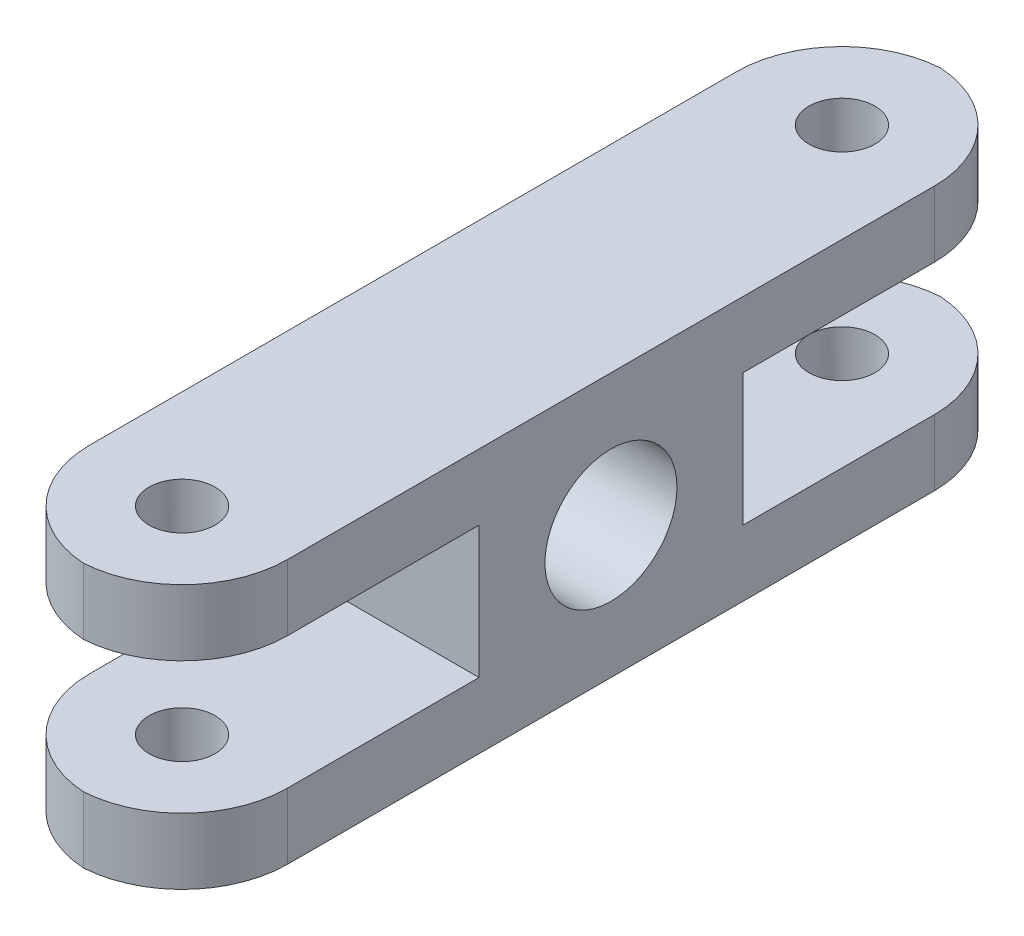
ISO-10303-21;
HEADER;
FILE_DESCRIPTION(('STEP AP214'),'2;1');
FILE_NAME('part.step','',(''),(''),'','','');
FILE_SCHEMA(('AUTOMOTIVE_DESIGN { 1 0 10303 214 1 1 1 1 }'));
ENDSEC;
DATA;
#1=APPLICATION_CONTEXT('core data for automotive mechanical design processes');
#2=APPLICATION_PROTOCOL_DEFINITION('international standard','automotive_design',2000,#1);
#3=PRODUCT_CONTEXT('',#1,'mechanical');
#4=PRODUCT('Part','Part','',(#3));
#5=PRODUCT_RELATED_PRODUCT_CATEGORY('part','',(#4));
#6=PRODUCT_DEFINITION_FORMATION('','',#4);
#7=PRODUCT_DEFINITION_CONTEXT('part definition',#1,'design');
#8=PRODUCT_DEFINITION('design','',#6,#7);
#9=PRODUCT_DEFINITION_SHAPE('','',#8);
#10=(LENGTH_UNIT() NAMED_UNIT(*) SI_UNIT(.MILLI.,.METRE.));
#11=(NAMED_UNIT(*) PLANE_ANGLE_UNIT() SI_UNIT($,.RADIAN.));
#12=(NAMED_UNIT(*) SI_UNIT($,.STERADIAN.) SOLID_ANGLE_UNIT());
#13=UNCERTAINTY_MEASURE_WITH_UNIT(LENGTH_MEASURE(1.E-05),#10,'distance_accuracy_value','');
#14=(GEOMETRIC_REPRESENTATION_CONTEXT(3) GLOBAL_UNCERTAINTY_ASSIGNED_CONTEXT((#13)) GLOBAL_UNIT_ASSIGNED_CONTEXT((#10,
#11,#12)) REPRESENTATION_CONTEXT('',''));
#15=CARTESIAN_POINT('',(0.,0.,0.));
#16=DIRECTION('',(0.,0.,1.));
#17=DIRECTION('',(1.,0.,0.));
#18=AXIS2_PLACEMENT_3D('',#15,#16,#17);
#19=CARTESIAN_POINT('',(7.5,20.,32.5));
#20=DIRECTION('',(-1.,0.,0.));
#21=DIRECTION('',(0.,0.,1.));
#22=AXIS2_PLACEMENT_3D('',#19,#20,#21);
#23=PLANE('',#22);
#24=CARTESIAN_POINT('',(7.5,10.,0.));
#25=DIRECTION('',(1.,0.,0.));
#26=DIRECTION('',(0.,0.,-1.));
#27=AXIS2_PLACEMENT_3D('',#24,#25,#26);
#28=CIRCLE('',#27,5.);
#29=CARTESIAN_POINT('',(7.5,10.,-5.));
#30=VERTEX_POINT('',#29);
#31=EDGE_CURVE('E212',#30,#30,#28,.T.);
#32=ORIENTED_EDGE('',*,*,#31,.F.);
#33=EDGE_LOOP('',(#32));
#34=FACE_BOUND('',#33,.T.);
#35=DIRECTION('',(0.,0.,1.));
#36=VECTOR('',#35,1.);
#37=CARTESIAN_POINT('',(7.5,5.,0.));
#38=LINE('',#37,#36);
#39=CARTESIAN_POINT('',(7.5,5.,9.99999999999999));
#40=VERTEX_POINT('',#39);
#41=CARTESIAN_POINT('',(7.5,5.,24.5));
#42=VERTEX_POINT('',#41);
#43=EDGE_CURVE('E167',#40,#42,#38,.T.);
#44=ORIENTED_EDGE('',*,*,#43,.T.);
#45=DIRECTION('',(0.,-1.,0.));
#46=VECTOR('',#45,1.);
#47=CARTESIAN_POINT('',(7.5,20.,24.5));
#48=LINE('',#47,#46);
#49=CARTESIAN_POINT('',(7.5,0.,24.5));
#50=VERTEX_POINT('',#49);
#51=EDGE_CURVE('E275',#42,#50,#48,.T.);
#52=ORIENTED_EDGE('',*,*,#51,.T.);
#53=DIRECTION('',(0.,0.,-1.));
#54=VECTOR('',#53,1.);
#55=CARTESIAN_POINT('',(7.5,0.,32.5));
#56=LINE('',#55,#54);
#57=CARTESIAN_POINT('',(7.5,0.,-24.5));
#58=VERTEX_POINT('',#57);
#59=EDGE_CURVE('E219',#50,#58,#56,.T.);
#60=ORIENTED_EDGE('',*,*,#59,.T.);
#61=DIRECTION('',(0.,-1.,0.));
#62=VECTOR('',#61,1.);
#63=CARTESIAN_POINT('',(7.5,20.,-24.5));
#64=LINE('',#63,#62);
#65=CARTESIAN_POINT('',(7.5,5.,-24.5));
#66=VERTEX_POINT('',#65);
#67=EDGE_CURVE('E272',#58,#66,#64,.F.);
#68=ORIENTED_EDGE('',*,*,#67,.T.);
#69=DIRECTION('',(0.,0.,-1.));
#70=VECTOR('',#69,1.);
#71=CARTESIAN_POINT('',(7.5,5.,0.));
#72=LINE('',#71,#70);
#73=CARTESIAN_POINT('',(7.5,5.,-10.));
#74=VERTEX_POINT('',#73);
#75=EDGE_CURVE('E190',#74,#66,#72,.T.);
#76=ORIENTED_EDGE('',*,*,#75,.F.);
#77=DIRECTION('',(0.,-1.,0.));
#78=VECTOR('',#77,1.);
#79=CARTESIAN_POINT('',(7.5,0.,-10.));
#80=LINE('',#79,#78);
#81=CARTESIAN_POINT('',(7.5,15.,-10.));
#82=VERTEX_POINT('',#81);
#83=EDGE_CURVE('E200',#82,#74,#80,.T.);
#84=ORIENTED_EDGE('',*,*,#83,.F.);
#85=DIRECTION('',(0.,0.,-1.));
#86=VECTOR('',#85,1.);
#87=CARTESIAN_POINT('',(7.5,15.,0.));
#88=LINE('',#87,#86);
#89=CARTESIAN_POINT('',(7.5,15.,-24.5));
#90=VERTEX_POINT('',#89);
#91=EDGE_CURVE('E197',#82,#90,#88,.T.);
#92=ORIENTED_EDGE('',*,*,#91,.T.);
#93=DIRECTION('',(0.,-1.,0.));
#94=VECTOR('',#93,1.);
#95=CARTESIAN_POINT('',(7.5,20.,-24.5));
#96=LINE('',#95,#94);
#97=CARTESIAN_POINT('',(7.5,20.,-24.5));
#98=VERTEX_POINT('',#97);
#99=EDGE_CURVE('E269',#90,#98,#96,.F.);
#100=ORIENTED_EDGE('',*,*,#99,.T.);
#101=DIRECTION('',(0.,0.,-1.));
#102=VECTOR('',#101,1.);
#103=CARTESIAN_POINT('',(7.5,20.,32.5));
#104=LINE('',#103,#102);
#105=CARTESIAN_POINT('',(7.5,20.,24.5));
#106=VERTEX_POINT('',#105);
#107=EDGE_CURVE('E228',#106,#98,#104,.T.);
#108=ORIENTED_EDGE('',*,*,#107,.F.);
#109=DIRECTION('',(0.,-1.,0.));
#110=VECTOR('',#109,1.);
#111=CARTESIAN_POINT('',(7.5,20.,24.5));
#112=LINE('',#111,#110);
#113=CARTESIAN_POINT('',(7.5,15.,24.5));
#114=VERTEX_POINT('',#113);
#115=EDGE_CURVE('E267',#106,#114,#112,.T.);
#116=ORIENTED_EDGE('',*,*,#115,.T.);
#117=DIRECTION('',(0.,0.,1.));
#118=VECTOR('',#117,1.);
#119=CARTESIAN_POINT('',(7.5,15.,0.));
#120=LINE('',#119,#118);
#121=CARTESIAN_POINT('',(7.5,15.,9.99999999999999));
#122=VERTEX_POINT('',#121);
#123=EDGE_CURVE('E175',#122,#114,#120,.T.);
#124=ORIENTED_EDGE('',*,*,#123,.F.);
#125=DIRECTION('',(0.,-1.,0.));
#126=VECTOR('',#125,1.);
#127=CARTESIAN_POINT('',(7.5,0.,9.99999999999999));
#128=LINE('',#127,#126);
#129=EDGE_CURVE('E177',#122,#40,#128,.T.);
#130=ORIENTED_EDGE('',*,*,#129,.T.);
#131=EDGE_LOOP('',(#44,#52,#60,#68,#76,#84,#92,#100,#108,#116,#124,#130));
#132=FACE_BOUND('',#131,.T.);
#133=ADVANCED_FACE('F36',(#34,#132),#23,.F.);
#134=CARTESIAN_POINT('',(-7.5,20.,32.5));
#135=DIRECTION('',(1.,0.,0.));
#136=DIRECTION('',(0.,0.,-1.));
#137=AXIS2_PLACEMENT_3D('',#134,#135,#136);
#138=PLANE('',#137);
#139=CARTESIAN_POINT('',(-7.5,10.,0.));
#140=DIRECTION('',(1.,0.,0.));
#141=DIRECTION('',(0.,0.,-1.));
#142=AXIS2_PLACEMENT_3D('',#139,#140,#141);
#143=CIRCLE('',#142,5.);
#144=CARTESIAN_POINT('',(-7.5,10.,-5.));
#145=VERTEX_POINT('',#144);
#146=EDGE_CURVE('E208',#145,#145,#143,.T.);
#147=ORIENTED_EDGE('',*,*,#146,.T.);
#148=EDGE_LOOP('',(#147));
#149=FACE_BOUND('',#148,.T.);
#150=DIRECTION('',(0.,0.,1.));
#151=VECTOR('',#150,1.);
#152=CARTESIAN_POINT('',(-7.5,0.,32.5));
#153=LINE('',#152,#151);
#154=CARTESIAN_POINT('',(-7.5,0.,-24.5));
#155=VERTEX_POINT('',#154);
#156=CARTESIAN_POINT('',(-7.5,0.,24.5));
#157=VERTEX_POINT('',#156);
#158=EDGE_CURVE('E231',#155,#157,#153,.T.);
#159=ORIENTED_EDGE('',*,*,#158,.T.);
#160=DIRECTION('',(0.,-1.,0.));
#161=VECTOR('',#160,1.);
#162=CARTESIAN_POINT('',(-7.5,20.,24.5));
#163=LINE('',#162,#161);
#164=CARTESIAN_POINT('',(-7.5,5.,24.5));
#165=VERTEX_POINT('',#164);
#166=EDGE_CURVE('E174',#157,#165,#163,.F.);
#167=ORIENTED_EDGE('',*,*,#166,.T.);
#168=DIRECTION('',(0.,0.,1.));
#169=VECTOR('',#168,1.);
#170=CARTESIAN_POINT('',(-7.5,5.,0.));
#171=LINE('',#170,#169);
#172=CARTESIAN_POINT('',(-7.5,5.,9.99999999999999));
#173=VERTEX_POINT('',#172);
#174=EDGE_CURVE('E161',#173,#165,#171,.T.);
#175=ORIENTED_EDGE('',*,*,#174,.F.);
#176=DIRECTION('',(0.,-1.,0.));
#177=VECTOR('',#176,1.);
#178=CARTESIAN_POINT('',(-7.5,0.,9.99999999999999));
#179=LINE('',#178,#177);
#180=CARTESIAN_POINT('',(-7.5,15.,9.99999999999999));
#181=VERTEX_POINT('',#180);
#182=EDGE_CURVE('E149',#181,#173,#179,.T.);
#183=ORIENTED_EDGE('',*,*,#182,.F.);
#184=DIRECTION('',(0.,0.,1.));
#185=VECTOR('',#184,1.);
#186=CARTESIAN_POINT('',(-7.5,15.,0.));
#187=LINE('',#186,#185);
#188=CARTESIAN_POINT('',(-7.5,15.,24.5));
#189=VERTEX_POINT('',#188);
#190=EDGE_CURVE('E160',#181,#189,#187,.T.);
#191=ORIENTED_EDGE('',*,*,#190,.T.);
#192=DIRECTION('',(0.,-1.,0.));
#193=VECTOR('',#192,1.);
#194=CARTESIAN_POINT('',(-7.5,20.,24.5));
#195=LINE('',#194,#193);
#196=CARTESIAN_POINT('',(-7.5,20.,24.5));
#197=VERTEX_POINT('',#196);
#198=EDGE_CURVE('E255',#189,#197,#195,.F.);
#199=ORIENTED_EDGE('',*,*,#198,.T.);
#200=DIRECTION('',(0.,0.,1.));
#201=VECTOR('',#200,1.);
#202=CARTESIAN_POINT('',(-7.5,20.,32.5));
#203=LINE('',#202,#201);
#204=CARTESIAN_POINT('',(-7.5,20.,-24.5));
#205=VERTEX_POINT('',#204);
#206=EDGE_CURVE('E230',#205,#197,#203,.T.);
#207=ORIENTED_EDGE('',*,*,#206,.F.);
#208=DIRECTION('',(0.,-1.,0.));
#209=VECTOR('',#208,1.);
#210=CARTESIAN_POINT('',(-7.5,20.,-24.5));
#211=LINE('',#210,#209);
#212=CARTESIAN_POINT('',(-7.5,15.,-24.5));
#213=VERTEX_POINT('',#212);
#214=EDGE_CURVE('E258',#205,#213,#211,.T.);
#215=ORIENTED_EDGE('',*,*,#214,.T.);
#216=DIRECTION('',(0.,0.,-1.));
#217=VECTOR('',#216,1.);
#218=CARTESIAN_POINT('',(-7.5,15.,0.));
#219=LINE('',#218,#217);
#220=CARTESIAN_POINT('',(-7.5,15.,-10.));
#221=VERTEX_POINT('',#220);
#222=EDGE_CURVE('E186',#221,#213,#219,.T.);
#223=ORIENTED_EDGE('',*,*,#222,.F.);
#224=DIRECTION('',(0.,-1.,0.));
#225=VECTOR('',#224,1.);
#226=CARTESIAN_POINT('',(-7.5,0.,-10.));
#227=LINE('',#226,#225);
#228=CARTESIAN_POINT('',(-7.5,5.,-10.));
#229=VERTEX_POINT('',#228);
#230=EDGE_CURVE('E189',#221,#229,#227,.T.);
#231=ORIENTED_EDGE('',*,*,#230,.T.);
#232=DIRECTION('',(0.,0.,-1.));
#233=VECTOR('',#232,1.);
#234=CARTESIAN_POINT('',(-7.5,5.,0.));
#235=LINE('',#234,#233);
#236=CARTESIAN_POINT('',(-7.5,5.,-24.5));
#237=VERTEX_POINT('',#236);
#238=EDGE_CURVE('E193',#229,#237,#235,.T.);
#239=ORIENTED_EDGE('',*,*,#238,.T.);
#240=DIRECTION('',(0.,-1.,0.));
#241=VECTOR('',#240,1.);
#242=CARTESIAN_POINT('',(-7.5,20.,-24.5));
#243=LINE('',#242,#241);
#244=EDGE_CURVE('E260',#237,#155,#243,.T.);
#245=ORIENTED_EDGE('',*,*,#244,.T.);
#246=EDGE_LOOP('',(#159,#167,#175,#183,#191,#199,#207,#215,#223,#231,#239,#245));
#247=FACE_BOUND('',#246,.T.);
#248=ADVANCED_FACE('F172',(#149,#247),#138,.F.);
#249=CARTESIAN_POINT('',(0.,0.,25.));
#250=DIRECTION('',(0.,1.,0.));
#251=DIRECTION('',(0.,0.,1.));
#252=AXIS2_PLACEMENT_3D('',#249,#250,#251);
#253=CYLINDRICAL_SURFACE('',#252,2.5);
#254=CARTESIAN_POINT('',(0.,0.,25.));
#255=DIRECTION('',(0.,-1.,0.));
#256=DIRECTION('',(0.,0.,-1.));
#257=AXIS2_PLACEMENT_3D('',#254,#255,#256);
#258=CIRCLE('',#257,2.5);
#259=CARTESIAN_POINT('',(0.,0.,22.5));
#260=VERTEX_POINT('',#259);
#261=EDGE_CURVE('E211',#260,#260,#258,.T.);
#262=ORIENTED_EDGE('',*,*,#261,.T.);
#263=EDGE_LOOP('',(#262));
#264=FACE_BOUND('',#263,.T.);
#265=CARTESIAN_POINT('',(0.,5.,25.));
#266=DIRECTION('',(0.,1.,0.));
#267=DIRECTION('',(0.,0.,1.));
#268=AXIS2_PLACEMENT_3D('',#265,#266,#267);
#269=CIRCLE('',#268,2.5);
#270=CARTESIAN_POINT('',(0.,5.,27.5));
#271=VERTEX_POINT('',#270);
#272=EDGE_CURVE('E243',#271,#271,#269,.T.);
#273=ORIENTED_EDGE('',*,*,#272,.T.);
#274=EDGE_LOOP('',(#273));
#275=FACE_BOUND('',#274,.T.);
#276=ADVANCED_FACE('F375',(#264,#275),#253,.F.);
#277=CARTESIAN_POINT('',(0.,0.,-25.));
#278=DIRECTION('',(0.,1.,0.));
#279=DIRECTION('',(0.,0.,1.));
#280=AXIS2_PLACEMENT_3D('',#277,#278,#279);
#281=CYLINDRICAL_SURFACE('',#280,2.5);
#282=CARTESIAN_POINT('',(0.,20.,-25.));
#283=DIRECTION('',(0.,1.,0.));
#284=DIRECTION('',(0.,0.,1.));
#285=AXIS2_PLACEMENT_3D('',#282,#283,#284);
#286=CIRCLE('',#285,2.5);
#287=CARTESIAN_POINT('',(0.,20.,-22.5));
#288=VERTEX_POINT('',#287);
#289=EDGE_CURVE('E220',#288,#288,#286,.T.);
#290=ORIENTED_EDGE('',*,*,#289,.T.);
#291=EDGE_LOOP('',(#290));
#292=FACE_BOUND('',#291,.T.);
#293=CARTESIAN_POINT('',(0.,15.,-25.));
#294=DIRECTION('',(0.,-1.,0.));
#295=DIRECTION('',(0.,0.,-1.));
#296=AXIS2_PLACEMENT_3D('',#293,#294,#295);
#297=CIRCLE('',#296,2.5);
#298=CARTESIAN_POINT('',(0.,15.,-27.5));
#299=VERTEX_POINT('',#298);
#300=EDGE_CURVE('E240',#299,#299,#297,.F.);
#301=ORIENTED_EDGE('',*,*,#300,.F.);
#302=EDGE_LOOP('',(#301));
#303=FACE_BOUND('',#302,.T.);
#304=ADVANCED_FACE('F478',(#292,#303),#281,.F.);
#305=CARTESIAN_POINT('',(0.,20.,0.));
#306=DIRECTION('',(0.,-1.,0.));
#307=DIRECTION('',(0.,0.,-1.));
#308=AXIS2_PLACEMENT_3D('',#305,#306,#307);
#309=PLANE('',#308);
#310=ORIENTED_EDGE('',*,*,#107,.T.);
#311=CARTESIAN_POINT('',(-0.499999999999998,20.,-24.5));
#312=DIRECTION('',(0.,-1.,0.));
#313=DIRECTION('',(0.,0.,-1.));
#314=AXIS2_PLACEMENT_3D('',#311,#312,#313);
#315=CIRCLE('',#314,8.);
#316=CARTESIAN_POINT('',(0.,20.,-32.4843597113357));
#317=VERTEX_POINT('',#316);
#318=EDGE_CURVE('E59',#98,#317,#315,.F.);
#319=ORIENTED_EDGE('',*,*,#318,.T.);
#320=CARTESIAN_POINT('',(0.500000000000003,20.,-24.5));
#321=DIRECTION('',(0.,-1.,0.));
#322=DIRECTION('',(0.,0.,-1.));
#323=AXIS2_PLACEMENT_3D('',#320,#321,#322);
#324=CIRCLE('',#323,8.);
#325=EDGE_CURVE('E289',#317,#205,#324,.F.);
#326=ORIENTED_EDGE('',*,*,#325,.T.);
#327=ORIENTED_EDGE('',*,*,#206,.T.);
#328=CARTESIAN_POINT('',(0.500000000000003,20.,24.5));
#329=DIRECTION('',(0.,-1.,0.));
#330=DIRECTION('',(0.,0.,-1.));
#331=AXIS2_PLACEMENT_3D('',#328,#329,#330);
#332=CIRCLE('',#331,8.);
#333=CARTESIAN_POINT('',(0.,20.,32.4843597113356));
#334=VERTEX_POINT('',#333);
#335=EDGE_CURVE('E287',#197,#334,#332,.F.);
#336=ORIENTED_EDGE('',*,*,#335,.T.);
#337=CARTESIAN_POINT('',(-0.499999999999998,20.,24.5));
#338=DIRECTION('',(0.,-1.,0.));
#339=DIRECTION('',(0.,0.,-1.));
#340=AXIS2_PLACEMENT_3D('',#337,#338,#339);
#341=CIRCLE('',#340,8.);
#342=EDGE_CURVE('E285',#334,#106,#341,.F.);
#343=ORIENTED_EDGE('',*,*,#342,.T.);
#344=EDGE_LOOP('',(#310,#319,#326,#327,#336,#343));
#345=FACE_BOUND('',#344,.T.);
#346=CARTESIAN_POINT('',(0.,20.,25.));
#347=DIRECTION('',(0.,-1.,0.));
#348=DIRECTION('',(0.,0.,-1.));
#349=AXIS2_PLACEMENT_3D('',#346,#347,#348);
#350=CIRCLE('',#349,2.5);
#351=CARTESIAN_POINT('',(0.,20.,22.5));
#352=VERTEX_POINT('',#351);
#353=EDGE_CURVE('E223',#352,#352,#350,.T.);
#354=ORIENTED_EDGE('',*,*,#353,.T.);
#355=EDGE_LOOP('',(#354));
#356=FACE_BOUND('',#355,.T.);
#357=ORIENTED_EDGE('',*,*,#289,.F.);
#358=EDGE_LOOP('',(#357));
#359=FACE_BOUND('',#358,.T.);
#360=ADVANCED_FACE('F311',(#345,#356,#359),#309,.F.);
#361=CARTESIAN_POINT('',(0.,0.,0.));
#362=DIRECTION('',(0.,-1.,0.));
#363=DIRECTION('',(0.,0.,-1.));
#364=AXIS2_PLACEMENT_3D('',#361,#362,#363);
#365=PLANE('',#364);
#366=ORIENTED_EDGE('',*,*,#261,.F.);
#367=EDGE_LOOP('',(#366));
#368=FACE_BOUND('',#367,.T.);
#369=CARTESIAN_POINT('',(-0.499999999999998,0.,24.5));
#370=DIRECTION('',(0.,-1.,0.));
#371=DIRECTION('',(0.,0.,-1.));
#372=AXIS2_PLACEMENT_3D('',#369,#370,#371);
#373=CIRCLE('',#372,8.);
#374=CARTESIAN_POINT('',(0.,0.,32.4843597113356));
#375=VERTEX_POINT('',#374);
#376=EDGE_CURVE('E251',#50,#375,#373,.T.);
#377=ORIENTED_EDGE('',*,*,#376,.T.);
#378=CARTESIAN_POINT('',(0.500000000000003,0.,24.5));
#379=DIRECTION('',(0.,-1.,0.));
#380=DIRECTION('',(0.,0.,-1.));
#381=AXIS2_PLACEMENT_3D('',#378,#379,#380);
#382=CIRCLE('',#381,8.);
#383=EDGE_CURVE('E253',#375,#157,#382,.T.);
#384=ORIENTED_EDGE('',*,*,#383,.T.);
#385=ORIENTED_EDGE('',*,*,#158,.F.);
#386=CARTESIAN_POINT('',(0.500000000000003,0.,-24.5));
#387=DIRECTION('',(0.,-1.,0.));
#388=DIRECTION('',(0.,0.,-1.));
#389=AXIS2_PLACEMENT_3D('',#386,#387,#388);
#390=CIRCLE('',#389,8.);
#391=CARTESIAN_POINT('',(0.,0.,-32.4843597113357));
#392=VERTEX_POINT('',#391);
#393=EDGE_CURVE('E234',#155,#392,#390,.T.);
#394=ORIENTED_EDGE('',*,*,#393,.T.);
#395=CARTESIAN_POINT('',(-0.499999999999998,0.,-24.5));
#396=DIRECTION('',(0.,-1.,0.));
#397=DIRECTION('',(0.,0.,-1.));
#398=AXIS2_PLACEMENT_3D('',#395,#396,#397);
#399=CIRCLE('',#398,8.);
#400=EDGE_CURVE('E249',#392,#58,#399,.T.);
#401=ORIENTED_EDGE('',*,*,#400,.T.);
#402=ORIENTED_EDGE('',*,*,#59,.F.);
#403=EDGE_LOOP('',(#377,#384,#385,#394,#401,#402));
#404=FACE_BOUND('',#403,.T.);
#405=CARTESIAN_POINT('',(0.,0.,-25.));
#406=DIRECTION('',(0.,1.,0.));
#407=DIRECTION('',(0.,0.,1.));
#408=AXIS2_PLACEMENT_3D('',#405,#406,#407);
#409=CIRCLE('',#408,2.5);
#410=CARTESIAN_POINT('',(0.,0.,-22.5));
#411=VERTEX_POINT('',#410);
#412=EDGE_CURVE('E216',#411,#411,#409,.T.);
#413=ORIENTED_EDGE('',*,*,#412,.T.);
#414=EDGE_LOOP('',(#413));
#415=FACE_BOUND('',#414,.T.);
#416=ADVANCED_FACE('F338',(#368,#404,#415),#365,.T.);
#417=CARTESIAN_POINT('',(0.,15.,25.));
#418=DIRECTION('',(0.,1.,0.));
#419=DIRECTION('',(0.,0.,1.));
#420=AXIS2_PLACEMENT_3D('',#417,#418,#419);
#421=CIRCLE('',#420,2.5);
#422=CARTESIAN_POINT('',(0.,15.,27.5));
#423=VERTEX_POINT('',#422);
#424=EDGE_CURVE('E215',#423,#423,#421,.T.);
#425=ORIENTED_EDGE('',*,*,#424,.F.);
#426=EDGE_LOOP('',(#425));
#427=FACE_BOUND('',#426,.T.);
#428=ORIENTED_EDGE('',*,*,#353,.F.);
#429=EDGE_LOOP('',(#428));
#430=FACE_BOUND('',#429,.T.);
#431=ADVANCED_FACE('F468',(#427,#430),#253,.F.);
#432=CARTESIAN_POINT('',(0.,5.,-25.));
#433=DIRECTION('',(0.,-1.,0.));
#434=DIRECTION('',(0.,0.,-1.));
#435=AXIS2_PLACEMENT_3D('',#432,#433,#434);
#436=CIRCLE('',#435,2.5);
#437=CARTESIAN_POINT('',(0.,5.,-27.5));
#438=VERTEX_POINT('',#437);
#439=EDGE_CURVE('E184',#438,#438,#436,.F.);
#440=ORIENTED_EDGE('',*,*,#439,.T.);
#441=EDGE_LOOP('',(#440));
#442=FACE_BOUND('',#441,.T.);
#443=ORIENTED_EDGE('',*,*,#412,.F.);
#444=EDGE_LOOP('',(#443));
#445=FACE_BOUND('',#444,.T.);
#446=ADVANCED_FACE('F505',(#442,#445),#281,.F.);
#447=CARTESIAN_POINT('',(-7.5,10.,0.));
#448=DIRECTION('',(1.,0.,0.));
#449=DIRECTION('',(0.,0.,-1.));
#450=AXIS2_PLACEMENT_3D('',#447,#448,#449);
#451=CYLINDRICAL_SURFACE('',#450,5.);
#452=ORIENTED_EDGE('',*,*,#146,.F.);
#453=EDGE_LOOP('',(#452));
#454=FACE_BOUND('',#453,.T.);
#455=ORIENTED_EDGE('',*,*,#31,.T.);
#456=EDGE_LOOP('',(#455));
#457=FACE_BOUND('',#456,.T.);
#458=ADVANCED_FACE('F458',(#454,#457),#451,.F.);
#459=CARTESIAN_POINT('',(-7.5,15.,0.));
#460=DIRECTION('',(0.,-1.,0.));
#461=DIRECTION('',(0.,0.,-1.));
#462=AXIS2_PLACEMENT_3D('',#459,#460,#461);
#463=PLANE('',#462);
#464=CARTESIAN_POINT('',(0.500000000000003,15.,-24.5));
#465=DIRECTION('',(0.,-1.,0.));
#466=DIRECTION('',(0.,0.,-1.));
#467=AXIS2_PLACEMENT_3D('',#464,#465,#466);
#468=CIRCLE('',#467,8.);
#469=CARTESIAN_POINT('',(0.,15.,-32.4843597113357));
#470=VERTEX_POINT('',#469);
#471=EDGE_CURVE('E281',#213,#470,#468,.T.);
#472=ORIENTED_EDGE('',*,*,#471,.T.);
#473=CARTESIAN_POINT('',(-0.499999999999998,15.,-24.5));
#474=DIRECTION('',(0.,-1.,0.));
#475=DIRECTION('',(0.,0.,-1.));
#476=AXIS2_PLACEMENT_3D('',#473,#474,#475);
#477=CIRCLE('',#476,8.);
#478=EDGE_CURVE('E283',#470,#90,#477,.T.);
#479=ORIENTED_EDGE('',*,*,#478,.T.);
#480=ORIENTED_EDGE('',*,*,#91,.F.);
#481=DIRECTION('',(1.,0.,0.));
#482=VECTOR('',#481,1.);
#483=CARTESIAN_POINT('',(-7.5,15.,-10.));
#484=LINE('',#483,#482);
#485=EDGE_CURVE('E196',#221,#82,#484,.T.);
#486=ORIENTED_EDGE('',*,*,#485,.F.);
#487=ORIENTED_EDGE('',*,*,#222,.T.);
#488=EDGE_LOOP('',(#472,#479,#480,#486,#487));
#489=FACE_BOUND('',#488,.T.);
#490=ORIENTED_EDGE('',*,*,#300,.T.);
#491=EDGE_LOOP('',(#490));
#492=FACE_BOUND('',#491,.T.);
#493=ADVANCED_FACE('F320',(#489,#492),#463,.T.);
#494=CARTESIAN_POINT('',(-7.5,5.,0.));
#495=DIRECTION('',(0.,-1.,0.));
#496=DIRECTION('',(0.,0.,-1.));
#497=AXIS2_PLACEMENT_3D('',#494,#495,#496);
#498=PLANE('',#497);
#499=ORIENTED_EDGE('',*,*,#75,.T.);
#500=CARTESIAN_POINT('',(-0.499999999999998,5.,-24.5));
#501=DIRECTION('',(0.,-1.,0.));
#502=DIRECTION('',(0.,0.,-1.));
#503=AXIS2_PLACEMENT_3D('',#500,#501,#502);
#504=CIRCLE('',#503,8.);
#505=CARTESIAN_POINT('',(0.,5.,-32.4843597113357));
#506=VERTEX_POINT('',#505);
#507=EDGE_CURVE('E279',#66,#506,#504,.F.);
#508=ORIENTED_EDGE('',*,*,#507,.T.);
#509=CARTESIAN_POINT('',(0.500000000000003,5.,-24.5));
#510=DIRECTION('',(0.,-1.,0.));
#511=DIRECTION('',(0.,0.,-1.));
#512=AXIS2_PLACEMENT_3D('',#509,#510,#511);
#513=CIRCLE('',#512,8.);
#514=EDGE_CURVE('E277',#506,#237,#513,.F.);
#515=ORIENTED_EDGE('',*,*,#514,.T.);
#516=ORIENTED_EDGE('',*,*,#238,.F.);
#517=DIRECTION('',(1.,0.,0.));
#518=VECTOR('',#517,1.);
#519=CARTESIAN_POINT('',(-7.5,5.,-10.));
#520=LINE('',#519,#518);
#521=EDGE_CURVE('E182',#229,#74,#520,.T.);
#522=ORIENTED_EDGE('',*,*,#521,.T.);
#523=EDGE_LOOP('',(#499,#508,#515,#516,#522));
#524=FACE_BOUND('',#523,.T.);
#525=ORIENTED_EDGE('',*,*,#439,.F.);
#526=EDGE_LOOP('',(#525));
#527=FACE_BOUND('',#526,.T.);
#528=ADVANCED_FACE('F349',(#524,#527),#498,.F.);
#529=CARTESIAN_POINT('',(-7.5,0.,-10.));
#530=DIRECTION('',(0.,0.,1.));
#531=DIRECTION('',(0.,-1.,0.));
#532=AXIS2_PLACEMENT_3D('',#529,#530,#531);
#533=PLANE('',#532);
#534=ORIENTED_EDGE('',*,*,#83,.T.);
#535=ORIENTED_EDGE('',*,*,#521,.F.);
#536=ORIENTED_EDGE('',*,*,#230,.F.);
#537=ORIENTED_EDGE('',*,*,#485,.T.);
#538=EDGE_LOOP('',(#534,#535,#536,#537));
#539=FACE_BOUND('',#538,.T.);
#540=ADVANCED_FACE('F358',(#539),#533,.F.);
#541=CARTESIAN_POINT('',(-7.5,15.,0.));
#542=DIRECTION('',(0.,1.,0.));
#543=DIRECTION('',(0.,0.,1.));
#544=AXIS2_PLACEMENT_3D('',#541,#542,#543);
#545=PLANE('',#544);
#546=ORIENTED_EDGE('',*,*,#424,.T.);
#547=EDGE_LOOP('',(#546));
#548=FACE_BOUND('',#547,.T.);
#549=CARTESIAN_POINT('',(-0.499999999999998,15.,24.5));
#550=DIRECTION('',(0.,1.,0.));
#551=DIRECTION('',(0.,0.,1.));
#552=AXIS2_PLACEMENT_3D('',#549,#550,#551);
#553=CIRCLE('',#552,8.);
#554=CARTESIAN_POINT('',(0.,15.,32.4843597113356));
#555=VERTEX_POINT('',#554);
#556=EDGE_CURVE('E45',#114,#555,#553,.F.);
#557=ORIENTED_EDGE('',*,*,#556,.T.);
#558=CARTESIAN_POINT('',(0.500000000000003,15.,24.5));
#559=DIRECTION('',(0.,1.,0.));
#560=DIRECTION('',(0.,0.,1.));
#561=AXIS2_PLACEMENT_3D('',#558,#559,#560);
#562=CIRCLE('',#561,8.);
#563=EDGE_CURVE('E11',#555,#189,#562,.F.);
#564=ORIENTED_EDGE('',*,*,#563,.T.);
#565=ORIENTED_EDGE('',*,*,#190,.F.);
#566=DIRECTION('',(1.,0.,0.));
#567=VECTOR('',#566,1.);
#568=CARTESIAN_POINT('',(-7.5,15.,9.99999999999999));
#569=LINE('',#568,#567);
#570=EDGE_CURVE('E155',#181,#122,#569,.T.);
#571=ORIENTED_EDGE('',*,*,#570,.T.);
#572=ORIENTED_EDGE('',*,*,#123,.T.);
#573=EDGE_LOOP('',(#557,#564,#565,#571,#572));
#574=FACE_BOUND('',#573,.T.);
#575=ADVANCED_FACE('F328',(#548,#574),#545,.F.);
#576=CARTESIAN_POINT('',(-7.5,0.,9.99999999999999));
#577=DIRECTION('',(0.,0.,1.));
#578=DIRECTION('',(0.,-1.,0.));
#579=AXIS2_PLACEMENT_3D('',#576,#577,#578);
#580=PLANE('',#579);
#581=ORIENTED_EDGE('',*,*,#129,.F.);
#582=ORIENTED_EDGE('',*,*,#570,.F.);
#583=ORIENTED_EDGE('',*,*,#182,.T.);
#584=DIRECTION('',(1.,0.,0.));
#585=VECTOR('',#584,1.);
#586=CARTESIAN_POINT('',(-7.5,5.,9.99999999999999));
#587=LINE('',#586,#585);
#588=EDGE_CURVE('E153',#173,#40,#587,.T.);
#589=ORIENTED_EDGE('',*,*,#588,.T.);
#590=EDGE_LOOP('',(#581,#582,#583,#589));
#591=FACE_BOUND('',#590,.T.);
#592=ADVANCED_FACE('F152',(#591),#580,.T.);
#593=CARTESIAN_POINT('',(-7.5,5.,0.));
#594=DIRECTION('',(0.,1.,0.));
#595=DIRECTION('',(0.,0.,1.));
#596=AXIS2_PLACEMENT_3D('',#593,#594,#595);
#597=PLANE('',#596);
#598=ORIENTED_EDGE('',*,*,#272,.F.);
#599=EDGE_LOOP('',(#598));
#600=FACE_BOUND('',#599,.T.);
#601=ORIENTED_EDGE('',*,*,#174,.T.);
#602=CARTESIAN_POINT('',(0.500000000000003,5.,24.5));
#603=DIRECTION('',(0.,1.,0.));
#604=DIRECTION('',(0.,0.,1.));
#605=AXIS2_PLACEMENT_3D('',#602,#603,#604);
#606=CIRCLE('',#605,8.);
#607=CARTESIAN_POINT('',(0.,5.,32.4843597113356));
#608=VERTEX_POINT('',#607);
#609=EDGE_CURVE('E265',#165,#608,#606,.T.);
#610=ORIENTED_EDGE('',*,*,#609,.T.);
#611=CARTESIAN_POINT('',(-0.499999999999998,5.,24.5));
#612=DIRECTION('',(0.,1.,0.));
#613=DIRECTION('',(0.,0.,1.));
#614=AXIS2_PLACEMENT_3D('',#611,#612,#613);
#615=CIRCLE('',#614,8.);
#616=EDGE_CURVE('E263',#608,#42,#615,.T.);
#617=ORIENTED_EDGE('',*,*,#616,.T.);
#618=ORIENTED_EDGE('',*,*,#43,.F.);
#619=ORIENTED_EDGE('',*,*,#588,.F.);
#620=EDGE_LOOP('',(#601,#610,#617,#618,#619));
#621=FACE_BOUND('',#620,.T.);
#622=ADVANCED_FACE('F165',(#600,#621),#597,.T.);
#623=CARTESIAN_POINT('',(-0.499999999999998,20.,24.5));
#624=DIRECTION('',(0.,-1.,0.));
#625=DIRECTION('',(0.,0.,-1.));
#626=AXIS2_PLACEMENT_3D('',#623,#624,#625);
#627=CYLINDRICAL_SURFACE('',#626,8.);
#628=ORIENTED_EDGE('',*,*,#51,.F.);
#629=ORIENTED_EDGE('',*,*,#616,.F.);
#630=DIRECTION('',(0.,-1.,0.));
#631=VECTOR('',#630,1.);
#632=CARTESIAN_POINT('',(0.,2.5,32.4843597113356));
#633=LINE('',#632,#631);
#634=EDGE_CURVE('E201',#375,#608,#633,.F.);
#635=ORIENTED_EDGE('',*,*,#634,.F.);
#636=ORIENTED_EDGE('',*,*,#376,.F.);
#637=EDGE_LOOP('',(#628,#629,#635,#636));
#638=FACE_BOUND('',#637,.T.);
#639=ADVANCED_FACE('F334',(#638),#627,.T.);
#640=CARTESIAN_POINT('',(0.500000000000003,20.,24.5));
#641=DIRECTION('',(0.,-1.,0.));
#642=DIRECTION('',(0.,0.,-1.));
#643=AXIS2_PLACEMENT_3D('',#640,#641,#642);
#644=CYLINDRICAL_SURFACE('',#643,8.);
#645=ORIENTED_EDGE('',*,*,#609,.F.);
#646=ORIENTED_EDGE('',*,*,#166,.F.);
#647=ORIENTED_EDGE('',*,*,#383,.F.);
#648=ORIENTED_EDGE('',*,*,#634,.T.);
#649=EDGE_LOOP('',(#645,#646,#647,#648));
#650=FACE_BOUND('',#649,.T.);
#651=ADVANCED_FACE('F381',(#650),#644,.T.);
#652=CARTESIAN_POINT('',(0.500000000000003,20.,-24.5));
#653=DIRECTION('',(0.,-1.,0.));
#654=DIRECTION('',(0.,0.,-1.));
#655=AXIS2_PLACEMENT_3D('',#652,#653,#654);
#656=CYLINDRICAL_SURFACE('',#655,8.);
#657=ORIENTED_EDGE('',*,*,#244,.F.);
#658=ORIENTED_EDGE('',*,*,#514,.F.);
#659=DIRECTION('',(0.,-1.,0.));
#660=VECTOR('',#659,1.);
#661=CARTESIAN_POINT('',(0.,2.5,-32.4843597113357));
#662=LINE('',#661,#660);
#663=EDGE_CURVE('E295',#392,#506,#662,.F.);
#664=ORIENTED_EDGE('',*,*,#663,.F.);
#665=ORIENTED_EDGE('',*,*,#393,.F.);
#666=EDGE_LOOP('',(#657,#658,#664,#665));
#667=FACE_BOUND('',#666,.T.);
#668=ADVANCED_FACE('F353',(#667),#656,.T.);
#669=CARTESIAN_POINT('',(-0.499999999999998,20.,-24.5));
#670=DIRECTION('',(0.,-1.,0.));
#671=DIRECTION('',(0.,0.,-1.));
#672=AXIS2_PLACEMENT_3D('',#669,#670,#671);
#673=CYLINDRICAL_SURFACE('',#672,8.);
#674=ORIENTED_EDGE('',*,*,#507,.F.);
#675=ORIENTED_EDGE('',*,*,#67,.F.);
#676=ORIENTED_EDGE('',*,*,#400,.F.);
#677=ORIENTED_EDGE('',*,*,#663,.T.);
#678=EDGE_LOOP('',(#674,#675,#676,#677));
#679=FACE_BOUND('',#678,.T.);
#680=ADVANCED_FACE('F345',(#679),#673,.T.);
#681=CARTESIAN_POINT('',(0.500000000000003,20.,-24.5));
#682=DIRECTION('',(0.,-1.,0.));
#683=DIRECTION('',(0.,0.,-1.));
#684=AXIS2_PLACEMENT_3D('',#681,#682,#683);
#685=CYLINDRICAL_SURFACE('',#684,8.);
#686=ORIENTED_EDGE('',*,*,#214,.F.);
#687=ORIENTED_EDGE('',*,*,#325,.F.);
#688=DIRECTION('',(0.,-1.,0.));
#689=VECTOR('',#688,1.);
#690=CARTESIAN_POINT('',(0.,17.5,-32.4843597113357));
#691=LINE('',#690,#689);
#692=EDGE_CURVE('E297',#470,#317,#691,.F.);
#693=ORIENTED_EDGE('',*,*,#692,.F.);
#694=ORIENTED_EDGE('',*,*,#471,.F.);
#695=EDGE_LOOP('',(#686,#687,#693,#694));
#696=FACE_BOUND('',#695,.T.);
#697=ADVANCED_FACE('F326',(#696),#685,.T.);
#698=CARTESIAN_POINT('',(-0.499999999999998,20.,-24.5));
#699=DIRECTION('',(0.,-1.,0.));
#700=DIRECTION('',(0.,0.,-1.));
#701=AXIS2_PLACEMENT_3D('',#698,#699,#700);
#702=CYLINDRICAL_SURFACE('',#701,8.);
#703=ORIENTED_EDGE('',*,*,#318,.F.);
#704=ORIENTED_EDGE('',*,*,#99,.F.);
#705=ORIENTED_EDGE('',*,*,#478,.F.);
#706=ORIENTED_EDGE('',*,*,#692,.T.);
#707=EDGE_LOOP('',(#703,#704,#705,#706));
#708=FACE_BOUND('',#707,.T.);
#709=ADVANCED_FACE('F318',(#708),#702,.T.);
#710=CARTESIAN_POINT('',(-0.499999999999998,20.,24.5));
#711=DIRECTION('',(0.,-1.,0.));
#712=DIRECTION('',(0.,0.,-1.));
#713=AXIS2_PLACEMENT_3D('',#710,#711,#712);
#714=CYLINDRICAL_SURFACE('',#713,8.);
#715=ORIENTED_EDGE('',*,*,#115,.F.);
#716=ORIENTED_EDGE('',*,*,#342,.F.);
#717=DIRECTION('',(0.,-1.,0.));
#718=VECTOR('',#717,1.);
#719=CARTESIAN_POINT('',(0.,17.5,32.4843597113356));
#720=LINE('',#719,#718);
#721=EDGE_CURVE('E40',#555,#334,#720,.F.);
#722=ORIENTED_EDGE('',*,*,#721,.F.);
#723=ORIENTED_EDGE('',*,*,#556,.F.);
#724=EDGE_LOOP('',(#715,#716,#722,#723));
#725=FACE_BOUND('',#724,.T.);
#726=ADVANCED_FACE('F38',(#725),#714,.T.);
#727=CARTESIAN_POINT('',(0.500000000000003,20.,24.5));
#728=DIRECTION('',(0.,-1.,0.));
#729=DIRECTION('',(0.,0.,-1.));
#730=AXIS2_PLACEMENT_3D('',#727,#728,#729);
#731=CYLINDRICAL_SURFACE('',#730,8.);
#732=ORIENTED_EDGE('',*,*,#335,.F.);
#733=ORIENTED_EDGE('',*,*,#198,.F.);
#734=ORIENTED_EDGE('',*,*,#563,.F.);
#735=ORIENTED_EDGE('',*,*,#721,.T.);
#736=EDGE_LOOP('',(#732,#733,#734,#735));
#737=FACE_BOUND('',#736,.T.);
#738=ADVANCED_FACE('F305',(#737),#731,.T.);
#739=CLOSED_SHELL('',(#133,#248,#276,#304,#360,#416,#431,#446,#458,#493,#528,#540,#575,#592,
#622,#639,#651,#668,#680,#697,#709,#726,#738));
#740=MANIFOLD_SOLID_BREP('B2',#739);
#741=ADVANCED_BREP_SHAPE_REPRESENTATION('',(#18,#740),#14);
#742=SHAPE_DEFINITION_REPRESENTATION(#9,#741);
ENDSEC;
END-ISO-10303-21;
